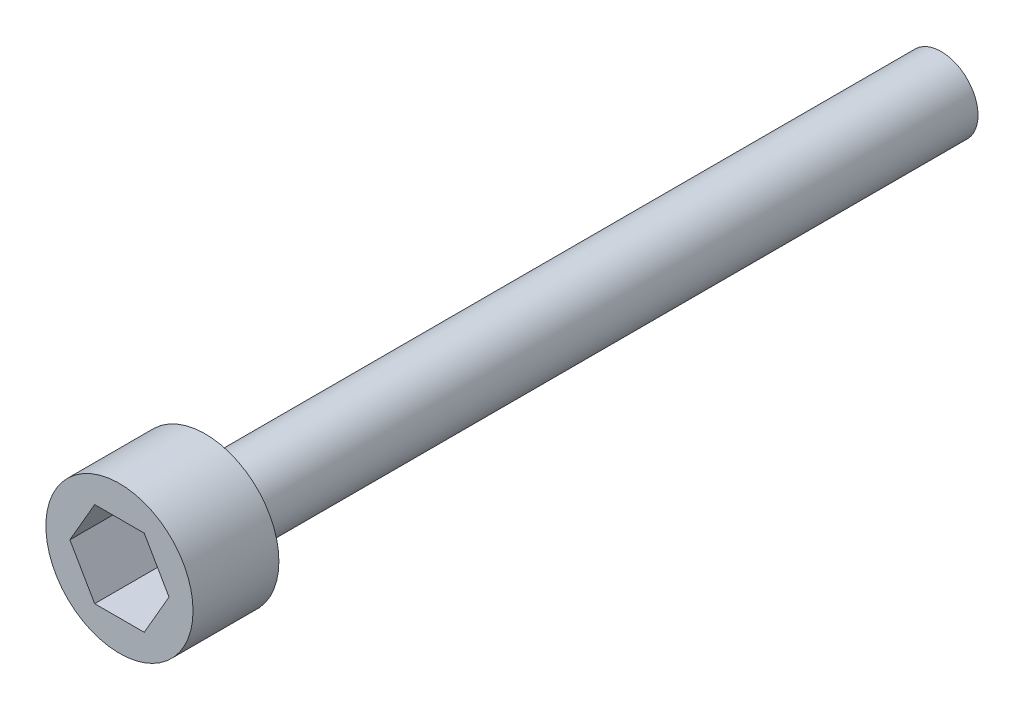
ISO-10303-21;
HEADER;
FILE_DESCRIPTION(('STEP AP214'),'2;1');
FILE_NAME('part.step','',(''),(''),'','','');
FILE_SCHEMA(('AUTOMOTIVE_DESIGN { 1 0 10303 214 1 1 1 1 }'));
ENDSEC;
DATA;
#1=APPLICATION_CONTEXT('core data for automotive mechanical design processes');
#2=APPLICATION_PROTOCOL_DEFINITION('international standard','automotive_design',2000,#1);
#3=PRODUCT_CONTEXT('',#1,'mechanical');
#4=PRODUCT('Part','Part','',(#3));
#5=PRODUCT_RELATED_PRODUCT_CATEGORY('part','',(#4));
#6=PRODUCT_DEFINITION_FORMATION('','',#4);
#7=PRODUCT_DEFINITION_CONTEXT('part definition',#1,'design');
#8=PRODUCT_DEFINITION('design','',#6,#7);
#9=PRODUCT_DEFINITION_SHAPE('','',#8);
#10=(LENGTH_UNIT() NAMED_UNIT(*) SI_UNIT(.MILLI.,.METRE.));
#11=(NAMED_UNIT(*) PLANE_ANGLE_UNIT() SI_UNIT($,.RADIAN.));
#12=(NAMED_UNIT(*) SI_UNIT($,.STERADIAN.) SOLID_ANGLE_UNIT());
#13=UNCERTAINTY_MEASURE_WITH_UNIT(LENGTH_MEASURE(1.E-05),#10,'distance_accuracy_value','');
#14=(GEOMETRIC_REPRESENTATION_CONTEXT(3) GLOBAL_UNCERTAINTY_ASSIGNED_CONTEXT((#13)) GLOBAL_UNIT_ASSIGNED_CONTEXT((#10,
#11,#12)) REPRESENTATION_CONTEXT('',''));
#15=CARTESIAN_POINT('',(0.,0.,0.));
#16=DIRECTION('',(0.,0.,1.));
#17=DIRECTION('',(1.,0.,0.));
#18=AXIS2_PLACEMENT_3D('',#15,#16,#17);
#19=CARTESIAN_POINT('',(0.,0.,3.5));
#20=DIRECTION('',(0.,0.,-1.));
#21=DIRECTION('',(-1.,0.,0.));
#22=AXIS2_PLACEMENT_3D('',#19,#20,#21);
#23=CYLINDRICAL_SURFACE('',#22,3.);
#24=CARTESIAN_POINT('',(0.,0.,3.5));
#25=DIRECTION('',(0.,0.,1.));
#26=DIRECTION('',(1.,0.,0.));
#27=AXIS2_PLACEMENT_3D('',#24,#25,#26);
#28=CIRCLE('',#27,3.);
#29=CARTESIAN_POINT('',(3.,0.,3.5));
#30=VERTEX_POINT('',#29);
#31=EDGE_CURVE('E11',#30,#30,#28,.T.);
#32=ORIENTED_EDGE('',*,*,#31,.F.);
#33=EDGE_LOOP('',(#32));
#34=FACE_BOUND('',#33,.T.);
#35=CARTESIAN_POINT('',(0.,0.,0.));
#36=DIRECTION('',(0.,0.,1.));
#37=DIRECTION('',(1.,0.,0.));
#38=AXIS2_PLACEMENT_3D('',#35,#36,#37);
#39=CIRCLE('',#38,3.);
#40=CARTESIAN_POINT('',(3.,0.,0.));
#41=VERTEX_POINT('',#40);
#42=EDGE_CURVE('E33',#41,#41,#39,.T.);
#43=ORIENTED_EDGE('',*,*,#42,.T.);
#44=EDGE_LOOP('',(#43));
#45=FACE_BOUND('',#44,.T.);
#46=ADVANCED_FACE('F30',(#34,#45),#23,.T.);
#47=CARTESIAN_POINT('',(0.,0.,3.5));
#48=DIRECTION('',(0.,0.,1.));
#49=DIRECTION('',(1.,0.,0.));
#50=AXIS2_PLACEMENT_3D('',#47,#48,#49);
#51=PLANE('',#50);
#52=DIRECTION('',(-0.499999999999528,-0.866025403784711,0.));
#53=VECTOR('',#52,1.);
#54=CARTESIAN_POINT('',(-2.02072594216261,2.1557411053031E-12,3.5));
#55=LINE('',#54,#53);
#56=CARTESIAN_POINT('',(-1.01036297108294,1.75000000000058,3.5));
#57=VERTEX_POINT('',#56);
#58=CARTESIAN_POINT('',(-2.02072594216261,2.15561075933568E-12,3.5));
#59=VERTEX_POINT('',#58);
#60=EDGE_CURVE('E44',#57,#59,#55,.T.);
#61=ORIENTED_EDGE('',*,*,#60,.F.);
#62=DIRECTION('',(-1.,-7.11024037944377E-13,0.));
#63=VECTOR('',#62,1.);
#64=CARTESIAN_POINT('',(-1.01036297108294,1.75000000000058,3.5));
#65=LINE('',#64,#63);
#66=CARTESIAN_POINT('',(1.01036297108301,1.75000000000202,3.5));
#67=VERTEX_POINT('',#66);
#68=EDGE_CURVE('E128',#67,#57,#65,.T.);
#69=ORIENTED_EDGE('',*,*,#68,.F.);
#70=DIRECTION('',(-0.50000000000043,0.86602540378419,0.));
#71=VECTOR('',#70,1.);
#72=CARTESIAN_POINT('',(1.01036297108301,1.75000000000202,3.5));
#73=LINE('',#72,#71);
#74=CARTESIAN_POINT('',(2.02072594216593,2.15574110530311E-12,3.5));
#75=VERTEX_POINT('',#74);
#76=EDGE_CURVE('E126',#75,#67,#73,.T.);
#77=ORIENTED_EDGE('',*,*,#76,.F.);
#78=DIRECTION('',(0.499999999999527,0.866025403784711,0.));
#79=VECTOR('',#78,1.);
#80=CARTESIAN_POINT('',(2.02072594216593,2.15574110530311E-12,3.5));
#81=LINE('',#80,#79);
#82=CARTESIAN_POINT('',(1.01036297108301,-1.75000000000192,3.5));
#83=VERTEX_POINT('',#82);
#84=EDGE_CURVE('E92',#83,#75,#81,.T.);
#85=ORIENTED_EDGE('',*,*,#84,.F.);
#86=DIRECTION('',(1.,7.11024037946673E-13,0.));
#87=VECTOR('',#86,1.);
#88=CARTESIAN_POINT('',(1.01036297108301,-1.75000000000192,3.5));
#89=LINE('',#88,#87);
#90=CARTESIAN_POINT('',(-1.01036297107642,-1.75000000000336,3.5));
#91=VERTEX_POINT('',#90);
#92=EDGE_CURVE('E122',#91,#83,#89,.T.);
#93=ORIENTED_EDGE('',*,*,#92,.F.);
#94=DIRECTION('',(0.500000000000431,-0.86602540378419,0.));
#95=VECTOR('',#94,1.);
#96=CARTESIAN_POINT('',(-1.01036297107642,-1.75000000000336,3.5));
#97=LINE('',#96,#95);
#98=EDGE_CURVE('E118',#59,#91,#97,.T.);
#99=ORIENTED_EDGE('',*,*,#98,.F.);
#100=EDGE_LOOP('',(#61,#69,#77,#85,#93,#99));
#101=FACE_BOUND('',#100,.T.);
#102=ORIENTED_EDGE('',*,*,#31,.T.);
#103=EDGE_LOOP('',(#102));
#104=FACE_BOUND('',#103,.T.);
#105=ADVANCED_FACE('F141',(#101,#104),#51,.T.);
#106=CARTESIAN_POINT('',(0.,0.,0.));
#107=DIRECTION('',(0.,0.,1.));
#108=DIRECTION('',(1.,0.,0.));
#109=AXIS2_PLACEMENT_3D('',#106,#107,#108);
#110=PLANE('',#109);
#111=CARTESIAN_POINT('',(0.,0.,0.));
#112=DIRECTION('',(0.,0.,1.));
#113=DIRECTION('',(1.,0.,0.));
#114=AXIS2_PLACEMENT_3D('',#111,#112,#113);
#115=CIRCLE('',#114,1.5);
#116=CARTESIAN_POINT('',(1.5,0.,0.));
#117=VERTEX_POINT('',#116);
#118=EDGE_CURVE('E148',#117,#117,#115,.T.);
#119=ORIENTED_EDGE('',*,*,#118,.T.);
#120=EDGE_LOOP('',(#119));
#121=FACE_BOUND('',#120,.T.);
#122=ORIENTED_EDGE('',*,*,#42,.F.);
#123=EDGE_LOOP('',(#122));
#124=FACE_BOUND('',#123,.T.);
#125=ADVANCED_FACE('F169',(#121,#124),#110,.F.);
#126=CARTESIAN_POINT('',(-2.02072594216261,2.1557411053031E-12,0.7));
#127=DIRECTION('',(-0.866025403784711,0.499999999999528,0.));
#128=DIRECTION('',(-0.499999999999528,-0.866025403784711,0.));
#129=AXIS2_PLACEMENT_3D('',#126,#127,#128);
#130=PLANE('',#129);
#131=ORIENTED_EDGE('',*,*,#60,.T.);
#132=DIRECTION('',(0.,0.,1.));
#133=VECTOR('',#132,1.);
#134=CARTESIAN_POINT('',(-2.02072594216261,2.1557411053031E-12,0.7));
#135=LINE('',#134,#133);
#136=CARTESIAN_POINT('',(-2.02072594216261,2.1557411053031E-12,0.7));
#137=VERTEX_POINT('',#136);
#138=EDGE_CURVE('E74',#137,#59,#135,.T.);
#139=ORIENTED_EDGE('',*,*,#138,.F.);
#140=DIRECTION('',(-0.499999999999528,-0.866025403784711,0.));
#141=VECTOR('',#140,1.);
#142=CARTESIAN_POINT('',(-2.02072594216261,2.1557411053031E-12,0.7));
#143=LINE('',#142,#141);
#144=CARTESIAN_POINT('',(-1.01036297108294,1.75000000000058,0.7));
#145=VERTEX_POINT('',#144);
#146=EDGE_CURVE('E130',#145,#137,#143,.T.);
#147=ORIENTED_EDGE('',*,*,#146,.F.);
#148=DIRECTION('',(0.,0.,1.));
#149=VECTOR('',#148,1.);
#150=CARTESIAN_POINT('',(-1.01036297108294,1.75000000000058,0.7));
#151=LINE('',#150,#149);
#152=EDGE_CURVE('E52',#145,#57,#151,.T.);
#153=ORIENTED_EDGE('',*,*,#152,.T.);
#154=EDGE_LOOP('',(#131,#139,#147,#153));
#155=FACE_BOUND('',#154,.T.);
#156=ADVANCED_FACE('F177',(#155),#130,.F.);
#157=CARTESIAN_POINT('',(-1.01036297108294,1.75000000000058,0.7));
#158=DIRECTION('',(-7.11024037944377E-13,1.,0.));
#159=DIRECTION('',(-1.,-7.11024037944377E-13,0.));
#160=AXIS2_PLACEMENT_3D('',#157,#158,#159);
#161=PLANE('',#160);
#162=ORIENTED_EDGE('',*,*,#68,.T.);
#163=ORIENTED_EDGE('',*,*,#152,.F.);
#164=DIRECTION('',(-1.,-7.11024037944377E-13,0.));
#165=VECTOR('',#164,1.);
#166=CARTESIAN_POINT('',(-1.01036297108294,1.75000000000058,0.7));
#167=LINE('',#166,#165);
#168=CARTESIAN_POINT('',(1.01036297108301,1.75000000000202,0.7));
#169=VERTEX_POINT('',#168);
#170=EDGE_CURVE('E104',#169,#145,#167,.T.);
#171=ORIENTED_EDGE('',*,*,#170,.F.);
#172=DIRECTION('',(0.,0.,1.));
#173=VECTOR('',#172,1.);
#174=CARTESIAN_POINT('',(1.01036297108301,1.75000000000202,0.7));
#175=LINE('',#174,#173);
#176=EDGE_CURVE('E96',#169,#67,#175,.T.);
#177=ORIENTED_EDGE('',*,*,#176,.T.);
#178=EDGE_LOOP('',(#162,#163,#171,#177));
#179=FACE_BOUND('',#178,.T.);
#180=ADVANCED_FACE('F182',(#179),#161,.F.);
#181=CARTESIAN_POINT('',(1.01036297108301,1.75000000000202,0.7));
#182=DIRECTION('',(0.86602540378419,0.50000000000043,0.));
#183=DIRECTION('',(-0.50000000000043,0.86602540378419,0.));
#184=AXIS2_PLACEMENT_3D('',#181,#182,#183);
#185=PLANE('',#184);
#186=ORIENTED_EDGE('',*,*,#76,.T.);
#187=ORIENTED_EDGE('',*,*,#176,.F.);
#188=DIRECTION('',(-0.50000000000043,0.86602540378419,0.));
#189=VECTOR('',#188,1.);
#190=CARTESIAN_POINT('',(1.01036297108301,1.75000000000202,0.7));
#191=LINE('',#190,#189);
#192=CARTESIAN_POINT('',(2.02072594216593,2.15574110530311E-12,0.7));
#193=VERTEX_POINT('',#192);
#194=EDGE_CURVE('E100',#193,#169,#191,.T.);
#195=ORIENTED_EDGE('',*,*,#194,.F.);
#196=DIRECTION('',(0.,0.,1.));
#197=VECTOR('',#196,1.);
#198=CARTESIAN_POINT('',(2.02072594216593,2.15574110530311E-12,0.7));
#199=LINE('',#198,#197);
#200=EDGE_CURVE('E85',#193,#75,#199,.T.);
#201=ORIENTED_EDGE('',*,*,#200,.T.);
#202=EDGE_LOOP('',(#186,#187,#195,#201));
#203=FACE_BOUND('',#202,.T.);
#204=ADVANCED_FACE('F101',(#203),#185,.F.);
#205=CARTESIAN_POINT('',(2.02072594216593,2.15574110530311E-12,0.7));
#206=DIRECTION('',(0.866025403784712,-0.499999999999527,0.));
#207=DIRECTION('',(0.499999999999527,0.866025403784712,0.));
#208=AXIS2_PLACEMENT_3D('',#205,#206,#207);
#209=PLANE('',#208);
#210=ORIENTED_EDGE('',*,*,#84,.T.);
#211=ORIENTED_EDGE('',*,*,#200,.F.);
#212=DIRECTION('',(0.499999999999527,0.866025403784711,0.));
#213=VECTOR('',#212,1.);
#214=CARTESIAN_POINT('',(2.02072594216593,2.15574110530311E-12,0.7));
#215=LINE('',#214,#213);
#216=CARTESIAN_POINT('',(1.01036297108301,-1.75000000000192,0.7));
#217=VERTEX_POINT('',#216);
#218=EDGE_CURVE('E89',#217,#193,#215,.T.);
#219=ORIENTED_EDGE('',*,*,#218,.F.);
#220=DIRECTION('',(0.,0.,1.));
#221=VECTOR('',#220,1.);
#222=CARTESIAN_POINT('',(1.01036297108301,-1.75000000000192,0.7));
#223=LINE('',#222,#221);
#224=EDGE_CURVE('E97',#217,#83,#223,.T.);
#225=ORIENTED_EDGE('',*,*,#224,.T.);
#226=EDGE_LOOP('',(#210,#211,#219,#225));
#227=FACE_BOUND('',#226,.T.);
#228=ADVANCED_FACE('F87',(#227),#209,.F.);
#229=CARTESIAN_POINT('',(1.01036297108301,-1.75000000000192,0.7));
#230=DIRECTION('',(7.11024037946673E-13,-1.,0.));
#231=DIRECTION('',(1.,7.11024037946673E-13,0.));
#232=AXIS2_PLACEMENT_3D('',#229,#230,#231);
#233=PLANE('',#232);
#234=ORIENTED_EDGE('',*,*,#92,.T.);
#235=ORIENTED_EDGE('',*,*,#224,.F.);
#236=DIRECTION('',(1.,7.11024037946673E-13,0.));
#237=VECTOR('',#236,1.);
#238=CARTESIAN_POINT('',(1.01036297108301,-1.75000000000192,0.7));
#239=LINE('',#238,#237);
#240=CARTESIAN_POINT('',(-1.01036297107642,-1.75000000000336,0.7));
#241=VERTEX_POINT('',#240);
#242=EDGE_CURVE('E110',#241,#217,#239,.T.);
#243=ORIENTED_EDGE('',*,*,#242,.F.);
#244=DIRECTION('',(0.,0.,1.));
#245=VECTOR('',#244,1.);
#246=CARTESIAN_POINT('',(-1.01036297107642,-1.75000000000336,0.7));
#247=LINE('',#246,#245);
#248=EDGE_CURVE('E134',#241,#91,#247,.T.);
#249=ORIENTED_EDGE('',*,*,#248,.T.);
#250=EDGE_LOOP('',(#234,#235,#243,#249));
#251=FACE_BOUND('',#250,.T.);
#252=ADVANCED_FACE('F145',(#251),#233,.F.);
#253=CARTESIAN_POINT('',(-1.01036297107642,-1.75000000000336,0.7));
#254=DIRECTION('',(-0.86602540378419,-0.500000000000431,0.));
#255=DIRECTION('',(0.500000000000431,-0.86602540378419,0.));
#256=AXIS2_PLACEMENT_3D('',#253,#254,#255);
#257=PLANE('',#256);
#258=ORIENTED_EDGE('',*,*,#98,.T.);
#259=ORIENTED_EDGE('',*,*,#248,.F.);
#260=DIRECTION('',(0.500000000000431,-0.86602540378419,0.));
#261=VECTOR('',#260,1.);
#262=CARTESIAN_POINT('',(-1.01036297107642,-1.75000000000336,0.7));
#263=LINE('',#262,#261);
#264=EDGE_CURVE('E112',#137,#241,#263,.T.);
#265=ORIENTED_EDGE('',*,*,#264,.F.);
#266=ORIENTED_EDGE('',*,*,#138,.T.);
#267=EDGE_LOOP('',(#258,#259,#265,#266));
#268=FACE_BOUND('',#267,.T.);
#269=ADVANCED_FACE('F138',(#268),#257,.F.);
#270=CARTESIAN_POINT('',(-1.01036297108294,1.75000000000058,0.7));
#271=DIRECTION('',(0.,0.,-1.));
#272=DIRECTION('',(-1.,0.,0.));
#273=AXIS2_PLACEMENT_3D('',#270,#271,#272);
#274=PLANE('',#273);
#275=ORIENTED_EDGE('',*,*,#146,.T.);
#276=ORIENTED_EDGE('',*,*,#264,.T.);
#277=ORIENTED_EDGE('',*,*,#242,.T.);
#278=ORIENTED_EDGE('',*,*,#218,.T.);
#279=ORIENTED_EDGE('',*,*,#194,.T.);
#280=ORIENTED_EDGE('',*,*,#170,.T.);
#281=EDGE_LOOP('',(#275,#276,#277,#278,#279,#280));
#282=FACE_BOUND('',#281,.T.);
#283=ADVANCED_FACE('F107',(#282),#274,.F.);
#284=CARTESIAN_POINT('',(0.,0.,-30.));
#285=DIRECTION('',(0.,0.,1.));
#286=DIRECTION('',(1.,0.,0.));
#287=AXIS2_PLACEMENT_3D('',#284,#285,#286);
#288=CYLINDRICAL_SURFACE('',#287,1.5);
#289=CARTESIAN_POINT('',(0.,0.,-30.));
#290=DIRECTION('',(0.,0.,1.));
#291=DIRECTION('',(1.,0.,0.));
#292=AXIS2_PLACEMENT_3D('',#289,#290,#291);
#293=CIRCLE('',#292,1.5);
#294=CARTESIAN_POINT('',(1.5,0.,-30.));
#295=VERTEX_POINT('',#294);
#296=EDGE_CURVE('E119',#295,#295,#293,.T.);
#297=ORIENTED_EDGE('',*,*,#296,.T.);
#298=EDGE_LOOP('',(#297));
#299=FACE_BOUND('',#298,.T.);
#300=ORIENTED_EDGE('',*,*,#118,.F.);
#301=EDGE_LOOP('',(#300));
#302=FACE_BOUND('',#301,.T.);
#303=ADVANCED_FACE('F154',(#299,#302),#288,.T.);
#304=CARTESIAN_POINT('',(0.,0.,-30.));
#305=DIRECTION('',(0.,0.,1.));
#306=DIRECTION('',(1.,0.,0.));
#307=AXIS2_PLACEMENT_3D('',#304,#305,#306);
#308=PLANE('',#307);
#309=ORIENTED_EDGE('',*,*,#296,.F.);
#310=EDGE_LOOP('',(#309));
#311=FACE_BOUND('',#310,.T.);
#312=ADVANCED_FACE('F157',(#311),#308,.F.);
#313=CLOSED_SHELL('',(#46,#105,#125,#156,#180,#204,#228,#252,#269,#283,#303,#312));
#314=MANIFOLD_SOLID_BREP('B2',#313);
#315=ADVANCED_BREP_SHAPE_REPRESENTATION('',(#18,#314),#14);
#316=SHAPE_DEFINITION_REPRESENTATION(#9,#315);
ENDSEC;
END-ISO-10303-21;
